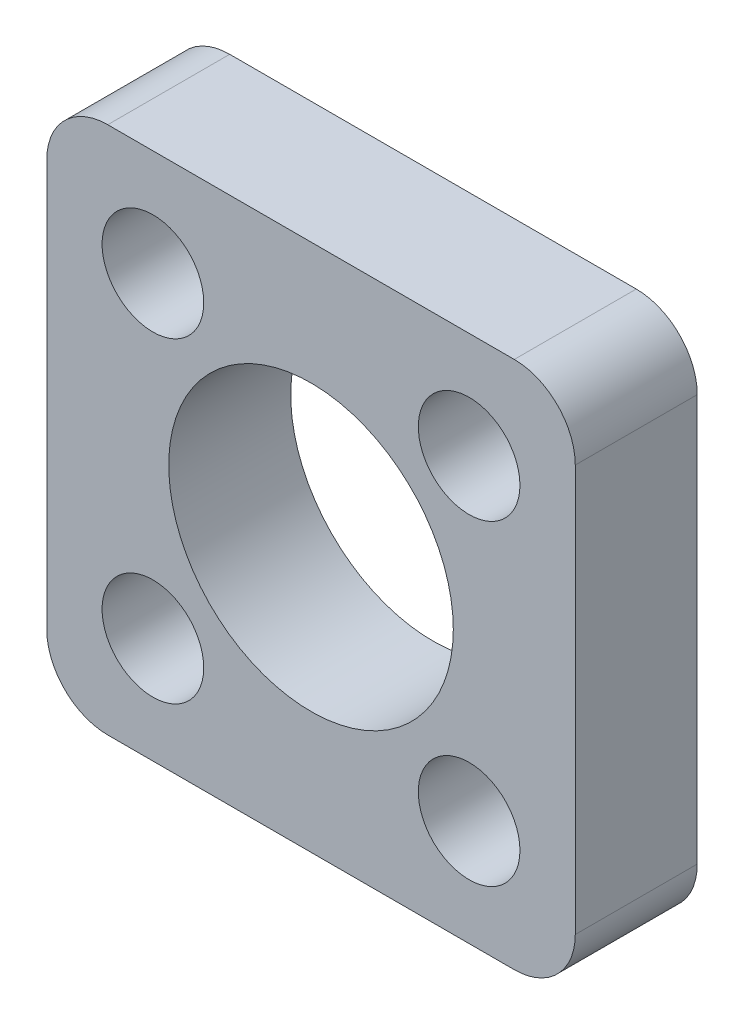
ISO-10303-21;
HEADER;
FILE_DESCRIPTION(('STEP AP214'),'2;1');
FILE_NAME('part.step','',(''),(''),'','','');
FILE_SCHEMA(('AUTOMOTIVE_DESIGN { 1 0 10303 214 1 1 1 1 }'));
ENDSEC;
DATA;
#1=APPLICATION_CONTEXT('core data for automotive mechanical design processes');
#2=APPLICATION_PROTOCOL_DEFINITION('international standard','automotive_design',2000,#1);
#3=PRODUCT_CONTEXT('',#1,'mechanical');
#4=PRODUCT('Part','Part','',(#3));
#5=PRODUCT_RELATED_PRODUCT_CATEGORY('part','',(#4));
#6=PRODUCT_DEFINITION_FORMATION('','',#4);
#7=PRODUCT_DEFINITION_CONTEXT('part definition',#1,'design');
#8=PRODUCT_DEFINITION('design','',#6,#7);
#9=PRODUCT_DEFINITION_SHAPE('','',#8);
#10=(LENGTH_UNIT() NAMED_UNIT(*) SI_UNIT(.MILLI.,.METRE.));
#11=(NAMED_UNIT(*) PLANE_ANGLE_UNIT() SI_UNIT($,.RADIAN.));
#12=(NAMED_UNIT(*) SI_UNIT($,.STERADIAN.) SOLID_ANGLE_UNIT());
#13=UNCERTAINTY_MEASURE_WITH_UNIT(LENGTH_MEASURE(1.E-05),#10,'distance_accuracy_value','');
#14=(GEOMETRIC_REPRESENTATION_CONTEXT(3) GLOBAL_UNCERTAINTY_ASSIGNED_CONTEXT((#13)) GLOBAL_UNIT_ASSIGNED_CONTEXT((#10,
#11,#12)) REPRESENTATION_CONTEXT('',''));
#15=CARTESIAN_POINT('',(0.,0.,0.));
#16=DIRECTION('',(0.,0.,1.));
#17=DIRECTION('',(1.,0.,0.));
#18=AXIS2_PLACEMENT_3D('',#15,#16,#17);
#19=CARTESIAN_POINT('',(-5.,5.,3.));
#20=DIRECTION('',(0.,0.,1.));
#21=DIRECTION('',(1.,0.,0.));
#22=AXIS2_PLACEMENT_3D('',#19,#20,#21);
#23=PLANE('',#22);
#24=CARTESIAN_POINT('',(3.88908729652621,-3.88908729652581,3.));
#25=DIRECTION('',(0.,0.,1.));
#26=DIRECTION('',(1.,0.,0.));
#27=AXIS2_PLACEMENT_3D('',#24,#25,#26);
#28=CIRCLE('',#27,1.25000000000031);
#29=CARTESIAN_POINT('',(5.13908729652652,-3.88908729652581,3.));
#30=VERTEX_POINT('',#29);
#31=EDGE_CURVE('E197',#30,#30,#28,.T.);
#32=ORIENTED_EDGE('',*,*,#31,.F.);
#33=EDGE_LOOP('',(#32));
#34=FACE_BOUND('',#33,.T.);
#35=CARTESIAN_POINT('',(-3.88908729652599,3.88908729652603,3.));
#36=DIRECTION('',(0.,0.,1.));
#37=DIRECTION('',(1.,0.,0.));
#38=AXIS2_PLACEMENT_3D('',#35,#36,#37);
#39=CIRCLE('',#38,1.25);
#40=CARTESIAN_POINT('',(-2.63908729652599,3.88908729652603,3.));
#41=VERTEX_POINT('',#40);
#42=EDGE_CURVE('E185',#41,#41,#39,.T.);
#43=ORIENTED_EDGE('',*,*,#42,.F.);
#44=EDGE_LOOP('',(#43));
#45=FACE_BOUND('',#44,.T.);
#46=CARTESIAN_POINT('',(-5.,5.,3.));
#47=DIRECTION('',(0.,0.,1.));
#48=DIRECTION('',(1.,0.,0.));
#49=AXIS2_PLACEMENT_3D('',#46,#47,#48);
#50=CIRCLE('',#49,1.5);
#51=CARTESIAN_POINT('',(-4.99999999999999,6.5,3.));
#52=VERTEX_POINT('',#51);
#53=CARTESIAN_POINT('',(-6.5,4.99999999999999,3.));
#54=VERTEX_POINT('',#53);
#55=EDGE_CURVE('E148',#52,#54,#50,.T.);
#56=ORIENTED_EDGE('',*,*,#55,.T.);
#57=DIRECTION('',(0.,-1.,0.));
#58=VECTOR('',#57,1.);
#59=CARTESIAN_POINT('',(-6.5,-4.99999999999999,3.));
#60=LINE('',#59,#58);
#61=CARTESIAN_POINT('',(-6.5,-5.,3.));
#62=VERTEX_POINT('',#61);
#63=EDGE_CURVE('E96',#54,#62,#60,.T.);
#64=ORIENTED_EDGE('',*,*,#63,.T.);
#65=CARTESIAN_POINT('',(-5.,-5.,3.));
#66=DIRECTION('',(0.,0.,1.));
#67=DIRECTION('',(-1.,0.,0.));
#68=AXIS2_PLACEMENT_3D('',#65,#66,#67);
#69=CIRCLE('',#68,1.5);
#70=CARTESIAN_POINT('',(-4.99999999999999,-6.5,3.));
#71=VERTEX_POINT('',#70);
#72=EDGE_CURVE('E163',#62,#71,#69,.T.);
#73=ORIENTED_EDGE('',*,*,#72,.T.);
#74=DIRECTION('',(1.,0.,0.));
#75=VECTOR('',#74,1.);
#76=CARTESIAN_POINT('',(4.99999999999999,-6.5,3.));
#77=LINE('',#76,#75);
#78=CARTESIAN_POINT('',(4.99999999999999,-6.5,3.));
#79=VERTEX_POINT('',#78);
#80=EDGE_CURVE('E176',#71,#79,#77,.T.);
#81=ORIENTED_EDGE('',*,*,#80,.T.);
#82=CARTESIAN_POINT('',(5.,-5.,3.));
#83=DIRECTION('',(0.,0.,1.));
#84=DIRECTION('',(1.,0.,0.));
#85=AXIS2_PLACEMENT_3D('',#82,#83,#84);
#86=CIRCLE('',#85,1.5);
#87=CARTESIAN_POINT('',(6.5,-4.99999999999999,3.));
#88=VERTEX_POINT('',#87);
#89=EDGE_CURVE('E115',#79,#88,#86,.T.);
#90=ORIENTED_EDGE('',*,*,#89,.T.);
#91=DIRECTION('',(0.,1.,0.));
#92=VECTOR('',#91,1.);
#93=CARTESIAN_POINT('',(6.5,-4.99999999999999,3.));
#94=LINE('',#93,#92);
#95=CARTESIAN_POINT('',(6.5,4.99999999999999,3.));
#96=VERTEX_POINT('',#95);
#97=EDGE_CURVE('E109',#88,#96,#94,.T.);
#98=ORIENTED_EDGE('',*,*,#97,.T.);
#99=CARTESIAN_POINT('',(5.,5.,3.));
#100=DIRECTION('',(0.,0.,1.));
#101=DIRECTION('',(1.,0.,0.));
#102=AXIS2_PLACEMENT_3D('',#99,#100,#101);
#103=CIRCLE('',#102,1.5);
#104=CARTESIAN_POINT('',(4.99999999999999,6.5,3.));
#105=VERTEX_POINT('',#104);
#106=EDGE_CURVE('E113',#96,#105,#103,.T.);
#107=ORIENTED_EDGE('',*,*,#106,.T.);
#108=DIRECTION('',(-1.,0.,0.));
#109=VECTOR('',#108,1.);
#110=CARTESIAN_POINT('',(4.99999999999999,6.5,3.));
#111=LINE('',#110,#109);
#112=EDGE_CURVE('E53',#105,#52,#111,.T.);
#113=ORIENTED_EDGE('',*,*,#112,.T.);
#114=EDGE_LOOP('',(#56,#64,#73,#81,#90,#98,#107,#113));
#115=FACE_BOUND('',#114,.T.);
#116=CARTESIAN_POINT('',(0.,0.,3.));
#117=DIRECTION('',(0.,0.,1.));
#118=DIRECTION('',(1.,0.,0.));
#119=AXIS2_PLACEMENT_3D('',#116,#117,#118);
#120=CIRCLE('',#119,3.5);
#121=CARTESIAN_POINT('',(3.5,0.,3.));
#122=VERTEX_POINT('',#121);
#123=EDGE_CURVE('E137',#122,#122,#120,.T.);
#124=ORIENTED_EDGE('',*,*,#123,.F.);
#125=EDGE_LOOP('',(#124));
#126=FACE_BOUND('',#125,.T.);
#127=CARTESIAN_POINT('',(3.88908729652603,3.88908729652621,3.));
#128=DIRECTION('',(0.,0.,1.));
#129=DIRECTION('',(1.,0.,0.));
#130=AXIS2_PLACEMENT_3D('',#127,#128,#129);
#131=CIRCLE('',#130,1.25000000000023);
#132=CARTESIAN_POINT('',(5.13908729652626,3.88908729652621,3.));
#133=VERTEX_POINT('',#132);
#134=EDGE_CURVE('E191',#133,#133,#131,.T.);
#135=ORIENTED_EDGE('',*,*,#134,.F.);
#136=EDGE_LOOP('',(#135));
#137=FACE_BOUND('',#136,.T.);
#138=CARTESIAN_POINT('',(-3.88908729652581,-3.88908729652599,3.));
#139=DIRECTION('',(0.,0.,1.));
#140=DIRECTION('',(1.,0.,0.));
#141=AXIS2_PLACEMENT_3D('',#138,#139,#140);
#142=CIRCLE('',#141,1.25000000000012);
#143=CARTESIAN_POINT('',(-2.6390872965257,-3.88908729652599,3.));
#144=VERTEX_POINT('',#143);
#145=EDGE_CURVE('E203',#144,#144,#142,.T.);
#146=ORIENTED_EDGE('',*,*,#145,.F.);
#147=EDGE_LOOP('',(#146));
#148=FACE_BOUND('',#147,.T.);
#149=ADVANCED_FACE('F36',(#34,#45,#115,#126,#137,#148),#23,.T.);
#150=CARTESIAN_POINT('',(-5.,5.,0.));
#151=DIRECTION('',(0.,0.,1.));
#152=DIRECTION('',(1.,0.,0.));
#153=AXIS2_PLACEMENT_3D('',#150,#151,#152);
#154=PLANE('',#153);
#155=CARTESIAN_POINT('',(-5.,5.,0.));
#156=DIRECTION('',(0.,0.,1.));
#157=DIRECTION('',(1.,0.,0.));
#158=AXIS2_PLACEMENT_3D('',#155,#156,#157);
#159=CIRCLE('',#158,1.5);
#160=CARTESIAN_POINT('',(-4.99999999999999,6.5,0.));
#161=VERTEX_POINT('',#160);
#162=CARTESIAN_POINT('',(-6.5,4.99999999999999,0.));
#163=VERTEX_POINT('',#162);
#164=EDGE_CURVE('E133',#161,#163,#159,.T.);
#165=ORIENTED_EDGE('',*,*,#164,.F.);
#166=DIRECTION('',(-1.,0.,0.));
#167=VECTOR('',#166,1.);
#168=CARTESIAN_POINT('',(4.99999999999999,6.5,0.));
#169=LINE('',#168,#167);
#170=CARTESIAN_POINT('',(4.99999999999999,6.5,0.));
#171=VERTEX_POINT('',#170);
#172=EDGE_CURVE('E88',#171,#161,#169,.T.);
#173=ORIENTED_EDGE('',*,*,#172,.F.);
#174=CARTESIAN_POINT('',(5.,5.,0.));
#175=DIRECTION('',(0.,0.,1.));
#176=DIRECTION('',(1.,0.,0.));
#177=AXIS2_PLACEMENT_3D('',#174,#175,#176);
#178=CIRCLE('',#177,1.5);
#179=CARTESIAN_POINT('',(6.5,4.99999999999999,0.));
#180=VERTEX_POINT('',#179);
#181=EDGE_CURVE('E82',#180,#171,#178,.T.);
#182=ORIENTED_EDGE('',*,*,#181,.F.);
#183=DIRECTION('',(0.,1.,0.));
#184=VECTOR('',#183,1.);
#185=CARTESIAN_POINT('',(6.5,-4.99999999999999,0.));
#186=LINE('',#185,#184);
#187=CARTESIAN_POINT('',(6.5,-4.99999999999999,0.));
#188=VERTEX_POINT('',#187);
#189=EDGE_CURVE('E123',#188,#180,#186,.T.);
#190=ORIENTED_EDGE('',*,*,#189,.F.);
#191=CARTESIAN_POINT('',(5.,-5.,0.));
#192=DIRECTION('',(0.,0.,1.));
#193=DIRECTION('',(1.,0.,0.));
#194=AXIS2_PLACEMENT_3D('',#191,#192,#193);
#195=CIRCLE('',#194,1.5);
#196=CARTESIAN_POINT('',(4.99999999999999,-6.5,0.));
#197=VERTEX_POINT('',#196);
#198=EDGE_CURVE('E143',#197,#188,#195,.T.);
#199=ORIENTED_EDGE('',*,*,#198,.F.);
#200=DIRECTION('',(1.,0.,0.));
#201=VECTOR('',#200,1.);
#202=CARTESIAN_POINT('',(4.99999999999999,-6.5,0.));
#203=LINE('',#202,#201);
#204=CARTESIAN_POINT('',(-4.99999999999999,-6.5,0.));
#205=VERTEX_POINT('',#204);
#206=EDGE_CURVE('E141',#205,#197,#203,.T.);
#207=ORIENTED_EDGE('',*,*,#206,.F.);
#208=CARTESIAN_POINT('',(-5.,-5.,0.));
#209=DIRECTION('',(0.,0.,1.));
#210=DIRECTION('',(-1.,0.,0.));
#211=AXIS2_PLACEMENT_3D('',#208,#209,#210);
#212=CIRCLE('',#211,1.5);
#213=CARTESIAN_POINT('',(-6.5,-5.,0.));
#214=VERTEX_POINT('',#213);
#215=EDGE_CURVE('E139',#214,#205,#212,.T.);
#216=ORIENTED_EDGE('',*,*,#215,.F.);
#217=DIRECTION('',(0.,-1.,0.));
#218=VECTOR('',#217,1.);
#219=CARTESIAN_POINT('',(-6.5,-4.99999999999999,0.));
#220=LINE('',#219,#218);
#221=EDGE_CURVE('E136',#163,#214,#220,.T.);
#222=ORIENTED_EDGE('',*,*,#221,.F.);
#223=EDGE_LOOP('',(#165,#173,#182,#190,#199,#207,#216,#222));
#224=FACE_BOUND('',#223,.T.);
#225=CARTESIAN_POINT('',(0.,0.,0.));
#226=DIRECTION('',(0.,0.,1.));
#227=DIRECTION('',(1.,0.,0.));
#228=AXIS2_PLACEMENT_3D('',#225,#226,#227);
#229=CIRCLE('',#228,3.5);
#230=CARTESIAN_POINT('',(3.5,0.,0.));
#231=VERTEX_POINT('',#230);
#232=EDGE_CURVE('E182',#231,#231,#229,.T.);
#233=ORIENTED_EDGE('',*,*,#232,.T.);
#234=EDGE_LOOP('',(#233));
#235=FACE_BOUND('',#234,.T.);
#236=CARTESIAN_POINT('',(-3.88908729652599,3.88908729652603,0.));
#237=DIRECTION('',(0.,0.,1.));
#238=DIRECTION('',(1.,0.,0.));
#239=AXIS2_PLACEMENT_3D('',#236,#237,#238);
#240=CIRCLE('',#239,1.25);
#241=CARTESIAN_POINT('',(-2.63908729652599,3.88908729652603,0.));
#242=VERTEX_POINT('',#241);
#243=EDGE_CURVE('E188',#242,#242,#240,.T.);
#244=ORIENTED_EDGE('',*,*,#243,.T.);
#245=EDGE_LOOP('',(#244));
#246=FACE_BOUND('',#245,.T.);
#247=CARTESIAN_POINT('',(3.88908729652603,3.88908729652621,0.));
#248=DIRECTION('',(0.,0.,1.));
#249=DIRECTION('',(1.,0.,0.));
#250=AXIS2_PLACEMENT_3D('',#247,#248,#249);
#251=CIRCLE('',#250,1.25000000000023);
#252=CARTESIAN_POINT('',(5.13908729652626,3.88908729652621,0.));
#253=VERTEX_POINT('',#252);
#254=EDGE_CURVE('E194',#253,#253,#251,.T.);
#255=ORIENTED_EDGE('',*,*,#254,.T.);
#256=EDGE_LOOP('',(#255));
#257=FACE_BOUND('',#256,.T.);
#258=CARTESIAN_POINT('',(3.88908729652621,-3.88908729652581,0.));
#259=DIRECTION('',(0.,0.,1.));
#260=DIRECTION('',(1.,0.,0.));
#261=AXIS2_PLACEMENT_3D('',#258,#259,#260);
#262=CIRCLE('',#261,1.25000000000031);
#263=CARTESIAN_POINT('',(5.13908729652652,-3.88908729652581,0.));
#264=VERTEX_POINT('',#263);
#265=EDGE_CURVE('E200',#264,#264,#262,.T.);
#266=ORIENTED_EDGE('',*,*,#265,.T.);
#267=EDGE_LOOP('',(#266));
#268=FACE_BOUND('',#267,.T.);
#269=CARTESIAN_POINT('',(-3.88908729652581,-3.88908729652599,0.));
#270=DIRECTION('',(0.,0.,1.));
#271=DIRECTION('',(1.,0.,0.));
#272=AXIS2_PLACEMENT_3D('',#269,#270,#271);
#273=CIRCLE('',#272,1.25000000000012);
#274=CARTESIAN_POINT('',(-2.6390872965257,-3.88908729652599,0.));
#275=VERTEX_POINT('',#274);
#276=EDGE_CURVE('E206',#275,#275,#273,.T.);
#277=ORIENTED_EDGE('',*,*,#276,.T.);
#278=EDGE_LOOP('',(#277));
#279=FACE_BOUND('',#278,.T.);
#280=ADVANCED_FACE('F167',(#224,#235,#246,#257,#268,#279),#154,.F.);
#281=CARTESIAN_POINT('',(-5.,5.,3.));
#282=DIRECTION('',(0.,0.,-1.));
#283=DIRECTION('',(-1.,0.,0.));
#284=AXIS2_PLACEMENT_3D('',#281,#282,#283);
#285=CYLINDRICAL_SURFACE('',#284,1.5);
#286=ORIENTED_EDGE('',*,*,#164,.T.);
#287=DIRECTION('',(0.,0.,-1.));
#288=VECTOR('',#287,1.);
#289=CARTESIAN_POINT('',(-6.5,4.99999999999999,3.));
#290=LINE('',#289,#288);
#291=EDGE_CURVE('E11',#54,#163,#290,.T.);
#292=ORIENTED_EDGE('',*,*,#291,.F.);
#293=ORIENTED_EDGE('',*,*,#55,.F.);
#294=DIRECTION('',(0.,0.,-1.));
#295=VECTOR('',#294,1.);
#296=CARTESIAN_POINT('',(-4.99999999999999,6.5,3.));
#297=LINE('',#296,#295);
#298=EDGE_CURVE('E129',#52,#161,#297,.T.);
#299=ORIENTED_EDGE('',*,*,#298,.T.);
#300=EDGE_LOOP('',(#286,#292,#293,#299));
#301=FACE_BOUND('',#300,.T.);
#302=ADVANCED_FACE('F38',(#301),#285,.T.);
#303=CARTESIAN_POINT('',(-6.5,-4.99999999999999,3.));
#304=DIRECTION('',(1.,0.,0.));
#305=DIRECTION('',(0.,0.,-1.));
#306=AXIS2_PLACEMENT_3D('',#303,#304,#305);
#307=PLANE('',#306);
#308=ORIENTED_EDGE('',*,*,#221,.T.);
#309=DIRECTION('',(0.,0.,-1.));
#310=VECTOR('',#309,1.);
#311=CARTESIAN_POINT('',(-6.5,-5.,3.));
#312=LINE('',#311,#310);
#313=EDGE_CURVE('E45',#62,#214,#312,.T.);
#314=ORIENTED_EDGE('',*,*,#313,.F.);
#315=ORIENTED_EDGE('',*,*,#63,.F.);
#316=ORIENTED_EDGE('',*,*,#291,.T.);
#317=EDGE_LOOP('',(#308,#314,#315,#316));
#318=FACE_BOUND('',#317,.T.);
#319=ADVANCED_FACE('F240',(#318),#307,.F.);
#320=CARTESIAN_POINT('',(-5.,-5.,3.));
#321=DIRECTION('',(0.,0.,-1.));
#322=DIRECTION('',(-1.,0.,0.));
#323=AXIS2_PLACEMENT_3D('',#320,#321,#322);
#324=CYLINDRICAL_SURFACE('',#323,1.5);
#325=ORIENTED_EDGE('',*,*,#215,.T.);
#326=DIRECTION('',(0.,0.,-1.));
#327=VECTOR('',#326,1.);
#328=CARTESIAN_POINT('',(-4.99999999999999,-6.5,3.));
#329=LINE('',#328,#327);
#330=EDGE_CURVE('E155',#71,#205,#329,.T.);
#331=ORIENTED_EDGE('',*,*,#330,.F.);
#332=ORIENTED_EDGE('',*,*,#72,.F.);
#333=ORIENTED_EDGE('',*,*,#313,.T.);
#334=EDGE_LOOP('',(#325,#331,#332,#333));
#335=FACE_BOUND('',#334,.T.);
#336=ADVANCED_FACE('F161',(#335),#324,.T.);
#337=CARTESIAN_POINT('',(4.99999999999999,-6.5,3.));
#338=DIRECTION('',(0.,1.,0.));
#339=DIRECTION('',(-1.,0.,0.));
#340=AXIS2_PLACEMENT_3D('',#337,#338,#339);
#341=PLANE('',#340);
#342=ORIENTED_EDGE('',*,*,#206,.T.);
#343=DIRECTION('',(0.,0.,-1.));
#344=VECTOR('',#343,1.);
#345=CARTESIAN_POINT('',(4.99999999999999,-6.5,3.));
#346=LINE('',#345,#344);
#347=EDGE_CURVE('E152',#79,#197,#346,.T.);
#348=ORIENTED_EDGE('',*,*,#347,.F.);
#349=ORIENTED_EDGE('',*,*,#80,.F.);
#350=ORIENTED_EDGE('',*,*,#330,.T.);
#351=EDGE_LOOP('',(#342,#348,#349,#350));
#352=FACE_BOUND('',#351,.T.);
#353=ADVANCED_FACE('F172',(#352),#341,.F.);
#354=CARTESIAN_POINT('',(5.,-5.,3.));
#355=DIRECTION('',(0.,0.,-1.));
#356=DIRECTION('',(-1.,0.,0.));
#357=AXIS2_PLACEMENT_3D('',#354,#355,#356);
#358=CYLINDRICAL_SURFACE('',#357,1.5);
#359=ORIENTED_EDGE('',*,*,#198,.T.);
#360=DIRECTION('',(0.,0.,-1.));
#361=VECTOR('',#360,1.);
#362=CARTESIAN_POINT('',(6.5,-4.99999999999999,3.));
#363=LINE('',#362,#361);
#364=EDGE_CURVE('E124',#88,#188,#363,.T.);
#365=ORIENTED_EDGE('',*,*,#364,.F.);
#366=ORIENTED_EDGE('',*,*,#89,.F.);
#367=ORIENTED_EDGE('',*,*,#347,.T.);
#368=EDGE_LOOP('',(#359,#365,#366,#367));
#369=FACE_BOUND('',#368,.T.);
#370=ADVANCED_FACE('F175',(#369),#358,.T.);
#371=CARTESIAN_POINT('',(6.5,-4.99999999999999,3.));
#372=DIRECTION('',(-1.,0.,0.));
#373=DIRECTION('',(0.,0.,1.));
#374=AXIS2_PLACEMENT_3D('',#371,#372,#373);
#375=PLANE('',#374);
#376=ORIENTED_EDGE('',*,*,#189,.T.);
#377=DIRECTION('',(0.,0.,-1.));
#378=VECTOR('',#377,1.);
#379=CARTESIAN_POINT('',(6.5,4.99999999999999,3.));
#380=LINE('',#379,#378);
#381=EDGE_CURVE('E120',#96,#180,#380,.T.);
#382=ORIENTED_EDGE('',*,*,#381,.F.);
#383=ORIENTED_EDGE('',*,*,#97,.F.);
#384=ORIENTED_EDGE('',*,*,#364,.T.);
#385=EDGE_LOOP('',(#376,#382,#383,#384));
#386=FACE_BOUND('',#385,.T.);
#387=ADVANCED_FACE('F121',(#386),#375,.F.);
#388=CARTESIAN_POINT('',(5.,5.,3.));
#389=DIRECTION('',(0.,0.,-1.));
#390=DIRECTION('',(-1.,0.,0.));
#391=AXIS2_PLACEMENT_3D('',#388,#389,#390);
#392=CYLINDRICAL_SURFACE('',#391,1.5);
#393=ORIENTED_EDGE('',*,*,#181,.T.);
#394=DIRECTION('',(0.,0.,-1.));
#395=VECTOR('',#394,1.);
#396=CARTESIAN_POINT('',(4.99999999999999,6.5,3.));
#397=LINE('',#396,#395);
#398=EDGE_CURVE('E125',#105,#171,#397,.T.);
#399=ORIENTED_EDGE('',*,*,#398,.F.);
#400=ORIENTED_EDGE('',*,*,#106,.F.);
#401=ORIENTED_EDGE('',*,*,#381,.T.);
#402=EDGE_LOOP('',(#393,#399,#400,#401));
#403=FACE_BOUND('',#402,.T.);
#404=ADVANCED_FACE('F127',(#403),#392,.T.);
#405=CARTESIAN_POINT('',(4.99999999999999,6.5,3.));
#406=DIRECTION('',(0.,-1.,0.));
#407=DIRECTION('',(1.,0.,0.));
#408=AXIS2_PLACEMENT_3D('',#405,#406,#407);
#409=PLANE('',#408);
#410=ORIENTED_EDGE('',*,*,#172,.T.);
#411=ORIENTED_EDGE('',*,*,#298,.F.);
#412=ORIENTED_EDGE('',*,*,#112,.F.);
#413=ORIENTED_EDGE('',*,*,#398,.T.);
#414=EDGE_LOOP('',(#410,#411,#412,#413));
#415=FACE_BOUND('',#414,.T.);
#416=ADVANCED_FACE('F228',(#415),#409,.F.);
#417=CARTESIAN_POINT('',(0.,0.,3.));
#418=DIRECTION('',(0.,0.,-1.));
#419=DIRECTION('',(-1.,0.,0.));
#420=AXIS2_PLACEMENT_3D('',#417,#418,#419);
#421=CYLINDRICAL_SURFACE('',#420,3.5);
#422=ORIENTED_EDGE('',*,*,#123,.T.);
#423=EDGE_LOOP('',(#422));
#424=FACE_BOUND('',#423,.T.);
#425=ORIENTED_EDGE('',*,*,#232,.F.);
#426=EDGE_LOOP('',(#425));
#427=FACE_BOUND('',#426,.T.);
#428=ADVANCED_FACE('F225',(#424,#427),#421,.F.);
#429=CARTESIAN_POINT('',(-3.88908729652599,3.88908729652603,3.));
#430=DIRECTION('',(0.,0.,-1.));
#431=DIRECTION('',(-1.,0.,0.));
#432=AXIS2_PLACEMENT_3D('',#429,#430,#431);
#433=CYLINDRICAL_SURFACE('',#432,1.25);
#434=ORIENTED_EDGE('',*,*,#42,.T.);
#435=EDGE_LOOP('',(#434));
#436=FACE_BOUND('',#435,.T.);
#437=ORIENTED_EDGE('',*,*,#243,.F.);
#438=EDGE_LOOP('',(#437));
#439=FACE_BOUND('',#438,.T.);
#440=ADVANCED_FACE('F316',(#436,#439),#433,.F.);
#441=CARTESIAN_POINT('',(3.88908729652603,3.88908729652621,3.));
#442=DIRECTION('',(0.,0.,-1.));
#443=DIRECTION('',(-1.,0.,0.));
#444=AXIS2_PLACEMENT_3D('',#441,#442,#443);
#445=CYLINDRICAL_SURFACE('',#444,1.25000000000023);
#446=ORIENTED_EDGE('',*,*,#134,.T.);
#447=EDGE_LOOP('',(#446));
#448=FACE_BOUND('',#447,.T.);
#449=ORIENTED_EDGE('',*,*,#254,.F.);
#450=EDGE_LOOP('',(#449));
#451=FACE_BOUND('',#450,.T.);
#452=ADVANCED_FACE('F325',(#448,#451),#445,.F.);
#453=CARTESIAN_POINT('',(3.88908729652621,-3.88908729652581,3.));
#454=DIRECTION('',(0.,0.,-1.));
#455=DIRECTION('',(-1.,0.,0.));
#456=AXIS2_PLACEMENT_3D('',#453,#454,#455);
#457=CYLINDRICAL_SURFACE('',#456,1.25000000000031);
#458=ORIENTED_EDGE('',*,*,#31,.T.);
#459=EDGE_LOOP('',(#458));
#460=FACE_BOUND('',#459,.T.);
#461=ORIENTED_EDGE('',*,*,#265,.F.);
#462=EDGE_LOOP('',(#461));
#463=FACE_BOUND('',#462,.T.);
#464=ADVANCED_FACE('F334',(#460,#463),#457,.F.);
#465=CARTESIAN_POINT('',(-3.88908729652581,-3.88908729652599,3.));
#466=DIRECTION('',(0.,0.,-1.));
#467=DIRECTION('',(-1.,0.,0.));
#468=AXIS2_PLACEMENT_3D('',#465,#466,#467);
#469=CYLINDRICAL_SURFACE('',#468,1.25000000000012);
#470=ORIENTED_EDGE('',*,*,#145,.T.);
#471=EDGE_LOOP('',(#470));
#472=FACE_BOUND('',#471,.T.);
#473=ORIENTED_EDGE('',*,*,#276,.F.);
#474=EDGE_LOOP('',(#473));
#475=FACE_BOUND('',#474,.T.);
#476=ADVANCED_FACE('F212',(#472,#475),#469,.F.);
#477=CLOSED_SHELL('',(#149,#280,#302,#319,#336,#353,#370,#387,#404,#416,#428,#440,#452,#464,#476));
#478=MANIFOLD_SOLID_BREP('B2',#477);
#479=ADVANCED_BREP_SHAPE_REPRESENTATION('',(#18,#478),#14);
#480=SHAPE_DEFINITION_REPRESENTATION(#9,#479);
ENDSEC;
END-ISO-10303-21;
